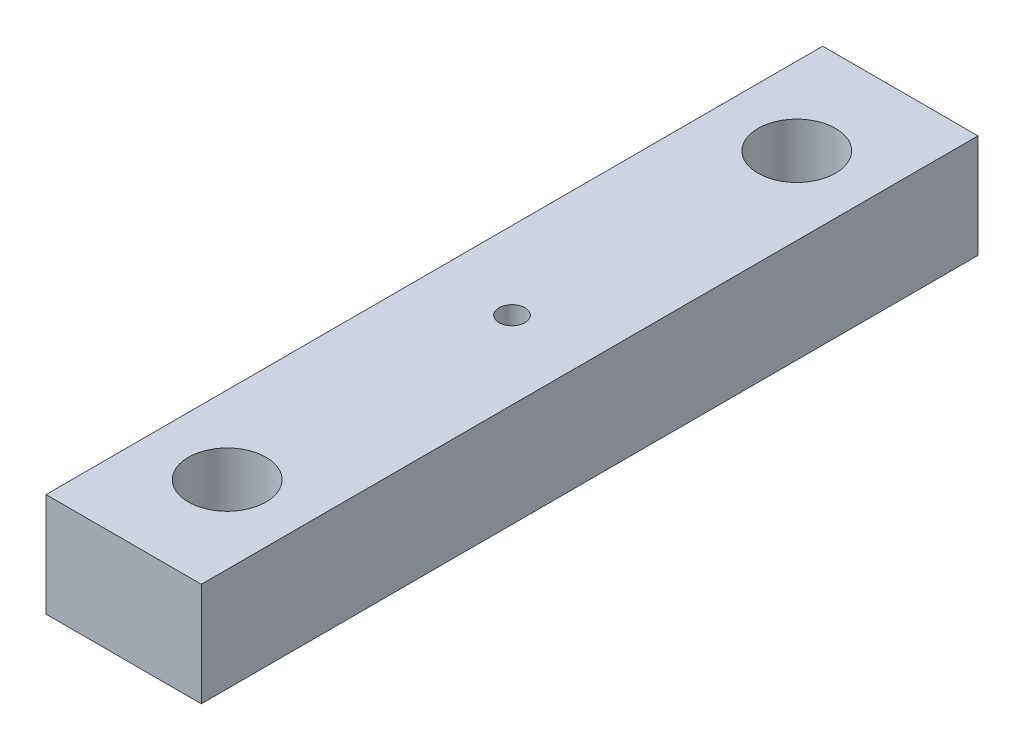
ISO-10303-21;
HEADER;
FILE_DESCRIPTION(('STEP AP214'),'2;1');
FILE_NAME('part.step','',(''),(''),'','','');
FILE_SCHEMA(('AUTOMOTIVE_DESIGN { 1 0 10303 214 1 1 1 1 }'));
ENDSEC;
DATA;
#1=APPLICATION_CONTEXT('core data for automotive mechanical design processes');
#2=APPLICATION_PROTOCOL_DEFINITION('international standard','automotive_design',2000,#1);
#3=PRODUCT_CONTEXT('',#1,'mechanical');
#4=PRODUCT('Part','Part','',(#3));
#5=PRODUCT_RELATED_PRODUCT_CATEGORY('part','',(#4));
#6=PRODUCT_DEFINITION_FORMATION('','',#4);
#7=PRODUCT_DEFINITION_CONTEXT('part definition',#1,'design');
#8=PRODUCT_DEFINITION('design','',#6,#7);
#9=PRODUCT_DEFINITION_SHAPE('','',#8);
#10=(LENGTH_UNIT() NAMED_UNIT(*) SI_UNIT(.MILLI.,.METRE.));
#11=(NAMED_UNIT(*) PLANE_ANGLE_UNIT() SI_UNIT($,.RADIAN.));
#12=(NAMED_UNIT(*) SI_UNIT($,.STERADIAN.) SOLID_ANGLE_UNIT());
#13=UNCERTAINTY_MEASURE_WITH_UNIT(LENGTH_MEASURE(1.E-05),#10,'distance_accuracy_value','');
#14=(GEOMETRIC_REPRESENTATION_CONTEXT(3) GLOBAL_UNCERTAINTY_ASSIGNED_CONTEXT((#13)) GLOBAL_UNIT_ASSIGNED_CONTEXT((#10,
#11,#12)) REPRESENTATION_CONTEXT('',''));
#15=CARTESIAN_POINT('',(0.,0.,0.));
#16=DIRECTION('',(0.,0.,1.));
#17=DIRECTION('',(1.,0.,0.));
#18=AXIS2_PLACEMENT_3D('',#15,#16,#17);
#19=CARTESIAN_POINT('',(0.,20.,0.));
#20=DIRECTION('',(0.,1.,0.));
#21=DIRECTION('',(0.,0.,1.));
#22=AXIS2_PLACEMENT_3D('',#19,#20,#21);
#23=PLANE('',#22);
#24=CARTESIAN_POINT('',(0.,20.,55.));
#25=DIRECTION('',(0.,1.,0.));
#26=DIRECTION('',(0.,0.,-1.));
#27=AXIS2_PLACEMENT_3D('',#24,#25,#26);
#28=CIRCLE('',#27,7.49999999999999);
#29=CARTESIAN_POINT('',(0.,20.,47.5));
#30=VERTEX_POINT('',#29);
#31=EDGE_CURVE('E115',#30,#30,#28,.T.);
#32=ORIENTED_EDGE('',*,*,#31,.F.);
#33=EDGE_LOOP('',(#32));
#34=FACE_BOUND('',#33,.T.);
#35=DIRECTION('',(0.,0.,1.));
#36=VECTOR('',#35,1.);
#37=CARTESIAN_POINT('',(-15.,20.,-75.));
#38=LINE('',#37,#36);
#39=CARTESIAN_POINT('',(-15.,20.,-75.));
#40=VERTEX_POINT('',#39);
#41=CARTESIAN_POINT('',(-15.,20.,75.));
#42=VERTEX_POINT('',#41);
#43=EDGE_CURVE('E85',#40,#42,#38,.T.);
#44=ORIENTED_EDGE('',*,*,#43,.T.);
#45=DIRECTION('',(1.,0.,0.));
#46=VECTOR('',#45,1.);
#47=CARTESIAN_POINT('',(-15.,20.,75.));
#48=LINE('',#47,#46);
#49=CARTESIAN_POINT('',(15.,20.,75.));
#50=VERTEX_POINT('',#49);
#51=EDGE_CURVE('E80',#42,#50,#48,.T.);
#52=ORIENTED_EDGE('',*,*,#51,.T.);
#53=DIRECTION('',(0.,0.,-1.));
#54=VECTOR('',#53,1.);
#55=CARTESIAN_POINT('',(15.,20.,-75.));
#56=LINE('',#55,#54);
#57=CARTESIAN_POINT('',(15.,20.,-75.));
#58=VERTEX_POINT('',#57);
#59=EDGE_CURVE('E83',#50,#58,#56,.T.);
#60=ORIENTED_EDGE('',*,*,#59,.T.);
#61=DIRECTION('',(-1.,0.,0.));
#62=VECTOR('',#61,1.);
#63=CARTESIAN_POINT('',(-15.,20.,-75.));
#64=LINE('',#63,#62);
#65=EDGE_CURVE('E50',#58,#40,#64,.T.);
#66=ORIENTED_EDGE('',*,*,#65,.T.);
#67=EDGE_LOOP('',(#44,#52,#60,#66));
#68=FACE_BOUND('',#67,.T.);
#69=CARTESIAN_POINT('',(0.,20.,-55.));
#70=DIRECTION('',(0.,1.,0.));
#71=DIRECTION('',(0.,0.,1.));
#72=AXIS2_PLACEMENT_3D('',#69,#70,#71);
#73=CIRCLE('',#72,7.5);
#74=CARTESIAN_POINT('',(0.,20.,-47.5));
#75=VERTEX_POINT('',#74);
#76=EDGE_CURVE('E100',#75,#75,#73,.T.);
#77=ORIENTED_EDGE('',*,*,#76,.F.);
#78=EDGE_LOOP('',(#77));
#79=FACE_BOUND('',#78,.T.);
#80=CARTESIAN_POINT('',(0.,20.,0.));
#81=DIRECTION('',(0.,1.,0.));
#82=DIRECTION('',(0.,0.,1.));
#83=AXIS2_PLACEMENT_3D('',#80,#81,#82);
#84=CIRCLE('',#83,2.5);
#85=CARTESIAN_POINT('',(0.,20.,2.5));
#86=VERTEX_POINT('',#85);
#87=EDGE_CURVE('E121',#86,#86,#84,.T.);
#88=ORIENTED_EDGE('',*,*,#87,.F.);
#89=EDGE_LOOP('',(#88));
#90=FACE_BOUND('',#89,.T.);
#91=ADVANCED_FACE('F33',(#34,#68,#79,#90),#23,.T.);
#92=CARTESIAN_POINT('',(0.,0.,0.));
#93=DIRECTION('',(0.,1.,0.));
#94=DIRECTION('',(0.,0.,1.));
#95=AXIS2_PLACEMENT_3D('',#92,#93,#94);
#96=PLANE('',#95);
#97=DIRECTION('',(0.,0.,1.));
#98=VECTOR('',#97,1.);
#99=CARTESIAN_POINT('',(-15.,0.,-75.));
#100=LINE('',#99,#98);
#101=CARTESIAN_POINT('',(-15.,0.,-75.));
#102=VERTEX_POINT('',#101);
#103=CARTESIAN_POINT('',(-15.,0.,75.));
#104=VERTEX_POINT('',#103);
#105=EDGE_CURVE('E97',#102,#104,#100,.T.);
#106=ORIENTED_EDGE('',*,*,#105,.F.);
#107=DIRECTION('',(-1.,0.,0.));
#108=VECTOR('',#107,1.);
#109=CARTESIAN_POINT('',(-15.,0.,-75.));
#110=LINE('',#109,#108);
#111=CARTESIAN_POINT('',(15.,0.,-75.));
#112=VERTEX_POINT('',#111);
#113=EDGE_CURVE('E73',#112,#102,#110,.T.);
#114=ORIENTED_EDGE('',*,*,#113,.F.);
#115=DIRECTION('',(0.,0.,-1.));
#116=VECTOR('',#115,1.);
#117=CARTESIAN_POINT('',(15.,0.,-75.));
#118=LINE('',#117,#116);
#119=CARTESIAN_POINT('',(15.,0.,75.));
#120=VERTEX_POINT('',#119);
#121=EDGE_CURVE('E67',#120,#112,#118,.T.);
#122=ORIENTED_EDGE('',*,*,#121,.F.);
#123=DIRECTION('',(1.,0.,0.));
#124=VECTOR('',#123,1.);
#125=CARTESIAN_POINT('',(-15.,0.,75.));
#126=LINE('',#125,#124);
#127=EDGE_CURVE('E89',#104,#120,#126,.T.);
#128=ORIENTED_EDGE('',*,*,#127,.F.);
#129=EDGE_LOOP('',(#106,#114,#122,#128));
#130=FACE_BOUND('',#129,.T.);
#131=CARTESIAN_POINT('',(0.,0.,-55.));
#132=DIRECTION('',(0.,1.,0.));
#133=DIRECTION('',(0.,0.,1.));
#134=AXIS2_PLACEMENT_3D('',#131,#132,#133);
#135=CIRCLE('',#134,7.5);
#136=CARTESIAN_POINT('',(0.,0.,-47.5));
#137=VERTEX_POINT('',#136);
#138=EDGE_CURVE('E112',#137,#137,#135,.T.);
#139=ORIENTED_EDGE('',*,*,#138,.T.);
#140=EDGE_LOOP('',(#139));
#141=FACE_BOUND('',#140,.T.);
#142=CARTESIAN_POINT('',(0.,0.,55.));
#143=DIRECTION('',(0.,1.,0.));
#144=DIRECTION('',(0.,0.,-1.));
#145=AXIS2_PLACEMENT_3D('',#142,#143,#144);
#146=CIRCLE('',#145,7.49999999999999);
#147=CARTESIAN_POINT('',(0.,0.,47.5));
#148=VERTEX_POINT('',#147);
#149=EDGE_CURVE('E118',#148,#148,#146,.T.);
#150=ORIENTED_EDGE('',*,*,#149,.T.);
#151=EDGE_LOOP('',(#150));
#152=FACE_BOUND('',#151,.T.);
#153=CARTESIAN_POINT('',(0.,0.,0.));
#154=DIRECTION('',(0.,1.,0.));
#155=DIRECTION('',(0.,0.,1.));
#156=AXIS2_PLACEMENT_3D('',#153,#154,#155);
#157=CIRCLE('',#156,2.5);
#158=CARTESIAN_POINT('',(0.,0.,2.5));
#159=VERTEX_POINT('',#158);
#160=EDGE_CURVE('E124',#159,#159,#157,.T.);
#161=ORIENTED_EDGE('',*,*,#160,.T.);
#162=EDGE_LOOP('',(#161));
#163=FACE_BOUND('',#162,.T.);
#164=ADVANCED_FACE('F108',(#130,#141,#152,#163),#96,.F.);
#165=CARTESIAN_POINT('',(-15.,20.,-75.));
#166=DIRECTION('',(1.,0.,0.));
#167=DIRECTION('',(0.,0.,-1.));
#168=AXIS2_PLACEMENT_3D('',#165,#166,#167);
#169=PLANE('',#168);
#170=ORIENTED_EDGE('',*,*,#105,.T.);
#171=DIRECTION('',(0.,-1.,0.));
#172=VECTOR('',#171,1.);
#173=CARTESIAN_POINT('',(-15.,20.,75.));
#174=LINE('',#173,#172);
#175=EDGE_CURVE('E11',#42,#104,#174,.T.);
#176=ORIENTED_EDGE('',*,*,#175,.F.);
#177=ORIENTED_EDGE('',*,*,#43,.F.);
#178=DIRECTION('',(0.,-1.,0.));
#179=VECTOR('',#178,1.);
#180=CARTESIAN_POINT('',(-15.,20.,-75.));
#181=LINE('',#180,#179);
#182=EDGE_CURVE('E93',#40,#102,#181,.T.);
#183=ORIENTED_EDGE('',*,*,#182,.T.);
#184=EDGE_LOOP('',(#170,#176,#177,#183));
#185=FACE_BOUND('',#184,.T.);
#186=ADVANCED_FACE('F35',(#185),#169,.F.);
#187=CARTESIAN_POINT('',(-15.,20.,75.));
#188=DIRECTION('',(0.,0.,-1.));
#189=DIRECTION('',(-1.,0.,0.));
#190=AXIS2_PLACEMENT_3D('',#187,#188,#189);
#191=PLANE('',#190);
#192=ORIENTED_EDGE('',*,*,#127,.T.);
#193=DIRECTION('',(0.,-1.,0.));
#194=VECTOR('',#193,1.);
#195=CARTESIAN_POINT('',(15.,20.,75.));
#196=LINE('',#195,#194);
#197=EDGE_CURVE('E42',#50,#120,#196,.T.);
#198=ORIENTED_EDGE('',*,*,#197,.F.);
#199=ORIENTED_EDGE('',*,*,#51,.F.);
#200=ORIENTED_EDGE('',*,*,#175,.T.);
#201=EDGE_LOOP('',(#192,#198,#199,#200));
#202=FACE_BOUND('',#201,.T.);
#203=ADVANCED_FACE('F88',(#202),#191,.F.);
#204=CARTESIAN_POINT('',(15.,20.,-75.));
#205=DIRECTION('',(-1.,0.,0.));
#206=DIRECTION('',(0.,0.,1.));
#207=AXIS2_PLACEMENT_3D('',#204,#205,#206);
#208=PLANE('',#207);
#209=ORIENTED_EDGE('',*,*,#121,.T.);
#210=DIRECTION('',(0.,-1.,0.));
#211=VECTOR('',#210,1.);
#212=CARTESIAN_POINT('',(15.,20.,-75.));
#213=LINE('',#212,#211);
#214=EDGE_CURVE('E90',#58,#112,#213,.T.);
#215=ORIENTED_EDGE('',*,*,#214,.F.);
#216=ORIENTED_EDGE('',*,*,#59,.F.);
#217=ORIENTED_EDGE('',*,*,#197,.T.);
#218=EDGE_LOOP('',(#209,#215,#216,#217));
#219=FACE_BOUND('',#218,.T.);
#220=ADVANCED_FACE('F91',(#219),#208,.F.);
#221=CARTESIAN_POINT('',(-15.,20.,-75.));
#222=DIRECTION('',(0.,0.,1.));
#223=DIRECTION('',(1.,0.,0.));
#224=AXIS2_PLACEMENT_3D('',#221,#222,#223);
#225=PLANE('',#224);
#226=ORIENTED_EDGE('',*,*,#113,.T.);
#227=ORIENTED_EDGE('',*,*,#182,.F.);
#228=ORIENTED_EDGE('',*,*,#65,.F.);
#229=ORIENTED_EDGE('',*,*,#214,.T.);
#230=EDGE_LOOP('',(#226,#227,#228,#229));
#231=FACE_BOUND('',#230,.T.);
#232=ADVANCED_FACE('F105',(#231),#225,.F.);
#233=CARTESIAN_POINT('',(0.,20.,-55.));
#234=DIRECTION('',(0.,-1.,0.));
#235=DIRECTION('',(0.,0.,-1.));
#236=AXIS2_PLACEMENT_3D('',#233,#234,#235);
#237=CYLINDRICAL_SURFACE('',#236,7.5);
#238=ORIENTED_EDGE('',*,*,#76,.T.);
#239=EDGE_LOOP('',(#238));
#240=FACE_BOUND('',#239,.T.);
#241=ORIENTED_EDGE('',*,*,#138,.F.);
#242=EDGE_LOOP('',(#241));
#243=FACE_BOUND('',#242,.T.);
#244=ADVANCED_FACE('F142',(#240,#243),#237,.F.);
#245=CARTESIAN_POINT('',(0.,20.,55.));
#246=DIRECTION('',(0.,-1.,0.));
#247=DIRECTION('',(0.,0.,-1.));
#248=AXIS2_PLACEMENT_3D('',#245,#246,#247);
#249=CYLINDRICAL_SURFACE('',#248,7.49999999999999);
#250=ORIENTED_EDGE('',*,*,#31,.T.);
#251=EDGE_LOOP('',(#250));
#252=FACE_BOUND('',#251,.T.);
#253=ORIENTED_EDGE('',*,*,#149,.F.);
#254=EDGE_LOOP('',(#253));
#255=FACE_BOUND('',#254,.T.);
#256=ADVANCED_FACE('F188',(#252,#255),#249,.F.);
#257=CARTESIAN_POINT('',(0.,20.,0.));
#258=DIRECTION('',(0.,-1.,0.));
#259=DIRECTION('',(0.,0.,-1.));
#260=AXIS2_PLACEMENT_3D('',#257,#258,#259);
#261=CYLINDRICAL_SURFACE('',#260,2.5);
#262=ORIENTED_EDGE('',*,*,#87,.T.);
#263=EDGE_LOOP('',(#262));
#264=FACE_BOUND('',#263,.T.);
#265=ORIENTED_EDGE('',*,*,#160,.F.);
#266=EDGE_LOOP('',(#265));
#267=FACE_BOUND('',#266,.T.);
#268=ADVANCED_FACE('F130',(#264,#267),#261,.F.);
#269=CLOSED_SHELL('',(#91,#164,#186,#203,#220,#232,#244,#256,#268));
#270=MANIFOLD_SOLID_BREP('B2',#269);
#271=ADVANCED_BREP_SHAPE_REPRESENTATION('',(#18,#270),#14);
#272=SHAPE_DEFINITION_REPRESENTATION(#9,#271);
ENDSEC;
END-ISO-10303-21;
